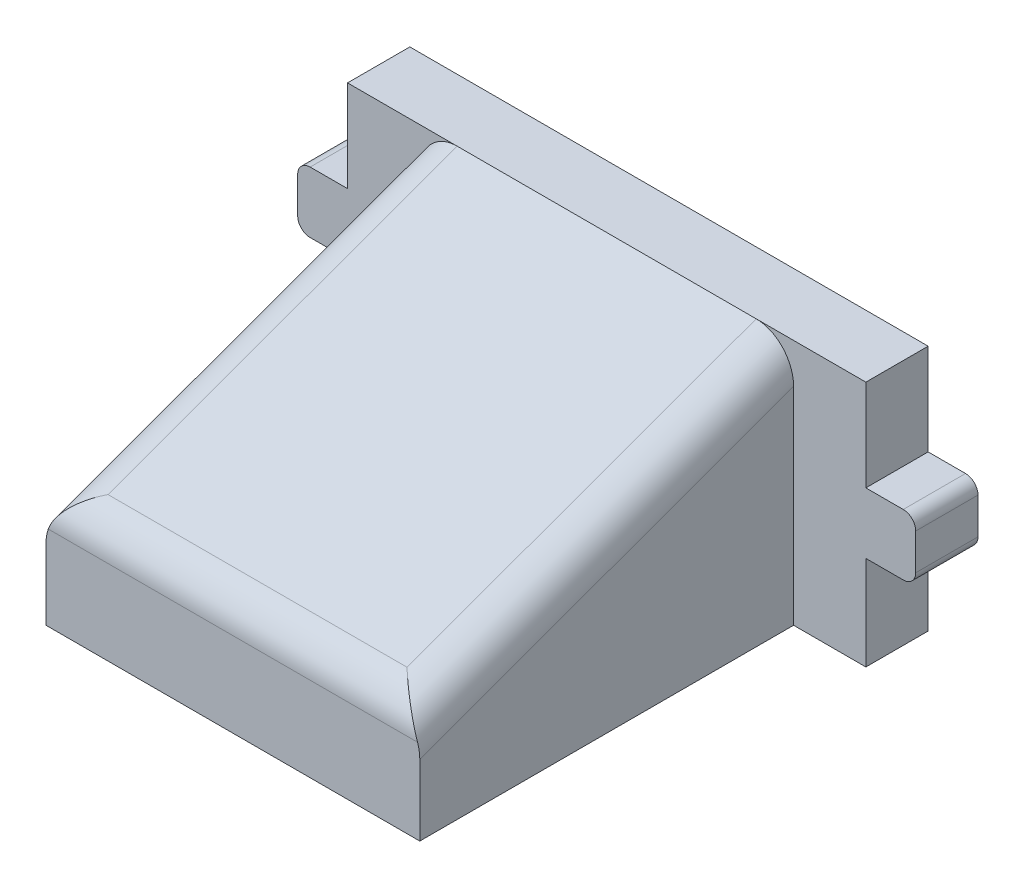
ISO-10303-21;
HEADER;
FILE_DESCRIPTION(('STEP AP214'),'2;1');
FILE_NAME('part.step','',(''),(''),'','','');
FILE_SCHEMA(('AUTOMOTIVE_DESIGN { 1 0 10303 214 1 1 1 1 }'));
ENDSEC;
DATA;
#1=APPLICATION_CONTEXT('core data for automotive mechanical design processes');
#2=APPLICATION_PROTOCOL_DEFINITION('international standard','automotive_design',2000,#1);
#3=PRODUCT_CONTEXT('',#1,'mechanical');
#4=PRODUCT('Part','Part','',(#3));
#5=PRODUCT_RELATED_PRODUCT_CATEGORY('part','',(#4));
#6=PRODUCT_DEFINITION_FORMATION('','',#4);
#7=PRODUCT_DEFINITION_CONTEXT('part definition',#1,'design');
#8=PRODUCT_DEFINITION('design','',#6,#7);
#9=PRODUCT_DEFINITION_SHAPE('','',#8);
#10=(LENGTH_UNIT() NAMED_UNIT(*) SI_UNIT(.MILLI.,.METRE.));
#11=(NAMED_UNIT(*) PLANE_ANGLE_UNIT() SI_UNIT($,.RADIAN.));
#12=(NAMED_UNIT(*) SI_UNIT($,.STERADIAN.) SOLID_ANGLE_UNIT());
#13=UNCERTAINTY_MEASURE_WITH_UNIT(LENGTH_MEASURE(1.E-05),#10,'distance_accuracy_value','');
#14=(GEOMETRIC_REPRESENTATION_CONTEXT(3) GLOBAL_UNCERTAINTY_ASSIGNED_CONTEXT((#13)) GLOBAL_UNIT_ASSIGNED_CONTEXT((#10,
#11,#12)) REPRESENTATION_CONTEXT('',''));
#15=CARTESIAN_POINT('',(0.,0.,0.));
#16=DIRECTION('',(0.,0.,1.));
#17=DIRECTION('',(1.,0.,0.));
#18=AXIS2_PLACEMENT_3D('',#15,#16,#17);
#19=CARTESIAN_POINT('',(0.,9.9,5.));
#20=DIRECTION('',(0.,0.939692620785908,0.342020143325669));
#21=DIRECTION('',(0.,-0.342020143325669,0.939692620785908));
#22=AXIS2_PLACEMENT_3D('',#19,#20,#21);
#23=PLANE('',#22);
#24=DIRECTION('',(1.,0.,0.));
#25=VECTOR('',#24,1.);
#26=CARTESIAN_POINT('',(-20.8,9.9,5.));
#27=LINE('',#26,#25);
#28=CARTESIAN_POINT('',(-12.,9.9,5.));
#29=VERTEX_POINT('',#28);
#30=CARTESIAN_POINT('',(12.,9.9,5.));
#31=VERTEX_POINT('',#30);
#32=EDGE_CURVE('E397',#29,#31,#27,.T.);
#33=ORIENTED_EDGE('',*,*,#32,.F.);
#34=DIRECTION('',(0.,0.342020143325669,-0.939692620785908));
#35=VECTOR('',#34,1.);
#36=CARTESIAN_POINT('',(-12.,9.9,5.));
#37=LINE('',#36,#35);
#38=CARTESIAN_POINT('',(-12.,-0.300651780257497,33.026060429977));
#39=VERTEX_POINT('',#38);
#40=EDGE_CURVE('E411',#29,#39,#37,.F.);
#41=ORIENTED_EDGE('',*,*,#40,.T.);
#42=DIRECTION('',(-1.,0.,0.));
#43=VECTOR('',#42,1.);
#44=CARTESIAN_POINT('',(15.,-0.300651780257497,33.026060429977));
#45=LINE('',#44,#43);
#46=CARTESIAN_POINT('',(12.,-0.300651780257497,33.026060429977));
#47=VERTEX_POINT('',#46);
#48=EDGE_CURVE('E408',#39,#47,#45,.F.);
#49=ORIENTED_EDGE('',*,*,#48,.T.);
#50=DIRECTION('',(0.,0.342020143325669,-0.939692620785908));
#51=VECTOR('',#50,1.);
#52=CARTESIAN_POINT('',(12.,9.9,5.));
#53=LINE('',#52,#51);
#54=EDGE_CURVE('E404',#47,#31,#53,.T.);
#55=ORIENTED_EDGE('',*,*,#54,.T.);
#56=EDGE_LOOP('',(#33,#41,#49,#55));
#57=FACE_BOUND('',#56,.T.);
#58=ADVANCED_FACE('F44',(#57),#23,.T.);
#59=CARTESIAN_POINT('',(0.,0.,5.));
#60=DIRECTION('',(0.,0.,1.));
#61=DIRECTION('',(1.,0.,0.));
#62=AXIS2_PLACEMENT_3D('',#59,#60,#61);
#63=PLANE('',#62);
#64=DIRECTION('',(0.,1.,0.));
#65=VECTOR('',#64,1.);
#66=CARTESIAN_POINT('',(15.,9.9,5.));
#67=LINE('',#66,#65);
#68=CARTESIAN_POINT('',(15.,-9.9,5.));
#69=VERTEX_POINT('',#68);
#70=CARTESIAN_POINT('',(15.,6.70746668257226,5.));
#71=VERTEX_POINT('',#70);
#72=EDGE_CURVE('E235',#69,#71,#67,.T.);
#73=ORIENTED_EDGE('',*,*,#72,.F.);
#74=DIRECTION('',(1.,0.,0.));
#75=VECTOR('',#74,1.);
#76=CARTESIAN_POINT('',(-20.8,-9.9,5.));
#77=LINE('',#76,#75);
#78=CARTESIAN_POINT('',(20.8,-9.9,5.));
#79=VERTEX_POINT('',#78);
#80=EDGE_CURVE('E310',#69,#79,#77,.T.);
#81=ORIENTED_EDGE('',*,*,#80,.T.);
#82=DIRECTION('',(0.,1.,0.));
#83=VECTOR('',#82,1.);
#84=CARTESIAN_POINT('',(20.8,9.9,5.));
#85=LINE('',#84,#83);
#86=CARTESIAN_POINT('',(20.8,-2.35,5.));
#87=VERTEX_POINT('',#86);
#88=EDGE_CURVE('E296',#79,#87,#85,.T.);
#89=ORIENTED_EDGE('',*,*,#88,.T.);
#90=DIRECTION('',(-1.,0.,0.));
#91=VECTOR('',#90,1.);
#92=CARTESIAN_POINT('',(24.8,-2.35,5.));
#93=LINE('',#92,#91);
#94=CARTESIAN_POINT('',(23.8,-2.35,5.));
#95=VERTEX_POINT('',#94);
#96=EDGE_CURVE('E286',#95,#87,#93,.T.);
#97=ORIENTED_EDGE('',*,*,#96,.F.);
#98=CARTESIAN_POINT('',(23.8,-1.35,5.));
#99=DIRECTION('',(0.,0.,1.));
#100=DIRECTION('',(1.,0.,0.));
#101=AXIS2_PLACEMENT_3D('',#98,#99,#100);
#102=CIRCLE('',#101,1.);
#103=CARTESIAN_POINT('',(24.8,-1.35,5.));
#104=VERTEX_POINT('',#103);
#105=EDGE_CURVE('E365',#95,#104,#102,.T.);
#106=ORIENTED_EDGE('',*,*,#105,.T.);
#107=DIRECTION('',(0.,-1.,0.));
#108=VECTOR('',#107,1.);
#109=CARTESIAN_POINT('',(24.8,2.55,5.));
#110=LINE('',#109,#108);
#111=CARTESIAN_POINT('',(24.8,1.55,5.));
#112=VERTEX_POINT('',#111);
#113=EDGE_CURVE('E272',#112,#104,#110,.T.);
#114=ORIENTED_EDGE('',*,*,#113,.F.);
#115=CARTESIAN_POINT('',(23.8,1.55,5.));
#116=DIRECTION('',(0.,0.,1.));
#117=DIRECTION('',(1.,0.,0.));
#118=AXIS2_PLACEMENT_3D('',#115,#116,#117);
#119=CIRCLE('',#118,1.);
#120=CARTESIAN_POINT('',(23.8,2.55,5.));
#121=VERTEX_POINT('',#120);
#122=EDGE_CURVE('E362',#112,#121,#119,.T.);
#123=ORIENTED_EDGE('',*,*,#122,.T.);
#124=DIRECTION('',(-1.,0.,0.));
#125=VECTOR('',#124,1.);
#126=CARTESIAN_POINT('',(24.8,2.55,5.));
#127=LINE('',#126,#125);
#128=CARTESIAN_POINT('',(20.8,2.55,5.));
#129=VERTEX_POINT('',#128);
#130=EDGE_CURVE('E289',#121,#129,#127,.T.);
#131=ORIENTED_EDGE('',*,*,#130,.T.);
#132=CARTESIAN_POINT('',(20.8,9.9,5.));
#133=VERTEX_POINT('',#132);
#134=EDGE_CURVE('E301',#129,#133,#85,.T.);
#135=ORIENTED_EDGE('',*,*,#134,.T.);
#136=DIRECTION('',(-1.,0.,0.));
#137=VECTOR('',#136,1.);
#138=CARTESIAN_POINT('',(-20.8,9.9,5.));
#139=LINE('',#138,#137);
#140=EDGE_CURVE('E302',#133,#31,#139,.T.);
#141=ORIENTED_EDGE('',*,*,#140,.T.);
#142=CARTESIAN_POINT('',(12.,6.70746668257226,5.));
#143=DIRECTION('',(0.,0.,1.));
#144=DIRECTION('',(0.,-1.,0.));
#145=AXIS2_PLACEMENT_3D('',#142,#143,#144);
#146=ELLIPSE('',#145,3.19253331742774,3.);
#147=EDGE_CURVE('E11',#31,#71,#146,.F.);
#148=ORIENTED_EDGE('',*,*,#147,.T.);
#149=EDGE_LOOP('',(#73,#81,#89,#97,#106,#114,#123,#131,#135,#141,#148));
#150=FACE_BOUND('',#149,.T.);
#151=ADVANCED_FACE('F460',(#150),#63,.T.);
#152=CARTESIAN_POINT('',(-20.8,9.9,5.));
#153=DIRECTION('',(1.,0.,0.));
#154=DIRECTION('',(0.,1.,0.));
#155=AXIS2_PLACEMENT_3D('',#152,#153,#154);
#156=PLANE('',#155);
#157=DIRECTION('',(0.,-1.,0.));
#158=VECTOR('',#157,1.);
#159=CARTESIAN_POINT('',(-20.8,9.9,0.));
#160=LINE('',#159,#158);
#161=CARTESIAN_POINT('',(-20.8,9.9,0.));
#162=VERTEX_POINT('',#161);
#163=CARTESIAN_POINT('',(-20.8,2.55,0.));
#164=VERTEX_POINT('',#163);
#165=EDGE_CURVE('E323',#162,#164,#160,.T.);
#166=ORIENTED_EDGE('',*,*,#165,.T.);
#167=DIRECTION('',(0.,0.,1.));
#168=VECTOR('',#167,1.);
#169=CARTESIAN_POINT('',(-20.8,2.55,5.));
#170=LINE('',#169,#168);
#171=CARTESIAN_POINT('',(-20.8,2.55,5.));
#172=VERTEX_POINT('',#171);
#173=EDGE_CURVE('E245',#164,#172,#170,.T.);
#174=ORIENTED_EDGE('',*,*,#173,.T.);
#175=DIRECTION('',(0.,-1.,0.));
#176=VECTOR('',#175,1.);
#177=CARTESIAN_POINT('',(-20.8,9.9,5.));
#178=LINE('',#177,#176);
#179=CARTESIAN_POINT('',(-20.8,9.9,5.));
#180=VERTEX_POINT('',#179);
#181=EDGE_CURVE('E306',#180,#172,#178,.T.);
#182=ORIENTED_EDGE('',*,*,#181,.F.);
#183=DIRECTION('',(0.,0.,-1.));
#184=VECTOR('',#183,1.);
#185=CARTESIAN_POINT('',(-20.8,9.9,5.));
#186=LINE('',#185,#184);
#187=EDGE_CURVE('E337',#180,#162,#186,.T.);
#188=ORIENTED_EDGE('',*,*,#187,.T.);
#189=EDGE_LOOP('',(#166,#174,#182,#188));
#190=FACE_BOUND('',#189,.T.);
#191=ADVANCED_FACE('F464',(#190),#156,.F.);
#192=CARTESIAN_POINT('',(20.8,9.9,5.));
#193=DIRECTION('',(-1.,0.,0.));
#194=DIRECTION('',(0.,0.,1.));
#195=AXIS2_PLACEMENT_3D('',#192,#193,#194);
#196=PLANE('',#195);
#197=DIRECTION('',(0.,0.,-1.));
#198=VECTOR('',#197,1.);
#199=CARTESIAN_POINT('',(20.8,-2.35,5.));
#200=LINE('',#199,#198);
#201=CARTESIAN_POINT('',(20.8,-2.35,0.));
#202=VERTEX_POINT('',#201);
#203=EDGE_CURVE('E273',#87,#202,#200,.T.);
#204=ORIENTED_EDGE('',*,*,#203,.F.);
#205=ORIENTED_EDGE('',*,*,#88,.F.);
#206=DIRECTION('',(0.,0.,-1.));
#207=VECTOR('',#206,1.);
#208=CARTESIAN_POINT('',(20.8,-9.9,5.));
#209=LINE('',#208,#207);
#210=CARTESIAN_POINT('',(20.8,-9.9,0.));
#211=VERTEX_POINT('',#210);
#212=EDGE_CURVE('E314',#79,#211,#209,.T.);
#213=ORIENTED_EDGE('',*,*,#212,.T.);
#214=DIRECTION('',(0.,1.,0.));
#215=VECTOR('',#214,1.);
#216=CARTESIAN_POINT('',(20.8,9.9,0.));
#217=LINE('',#216,#215);
#218=EDGE_CURVE('E315',#211,#202,#217,.T.);
#219=ORIENTED_EDGE('',*,*,#218,.T.);
#220=EDGE_LOOP('',(#204,#205,#213,#219));
#221=FACE_BOUND('',#220,.T.);
#222=ADVANCED_FACE('F487',(#221),#196,.F.);
#223=DIRECTION('',(0.,0.,1.));
#224=VECTOR('',#223,1.);
#225=CARTESIAN_POINT('',(20.8,2.55,5.));
#226=LINE('',#225,#224);
#227=CARTESIAN_POINT('',(20.8,2.55,0.));
#228=VERTEX_POINT('',#227);
#229=EDGE_CURVE('E267',#228,#129,#226,.T.);
#230=ORIENTED_EDGE('',*,*,#229,.F.);
#231=CARTESIAN_POINT('',(20.8,9.9,0.));
#232=VERTEX_POINT('',#231);
#233=EDGE_CURVE('E295',#228,#232,#217,.T.);
#234=ORIENTED_EDGE('',*,*,#233,.T.);
#235=DIRECTION('',(0.,0.,-1.));
#236=VECTOR('',#235,1.);
#237=CARTESIAN_POINT('',(20.8,9.9,5.));
#238=LINE('',#237,#236);
#239=EDGE_CURVE('E341',#133,#232,#238,.T.);
#240=ORIENTED_EDGE('',*,*,#239,.F.);
#241=ORIENTED_EDGE('',*,*,#134,.F.);
#242=EDGE_LOOP('',(#230,#234,#240,#241));
#243=FACE_BOUND('',#242,.T.);
#244=ADVANCED_FACE('F490',(#243),#196,.F.);
#245=CARTESIAN_POINT('',(-20.8,9.9,5.));
#246=DIRECTION('',(0.,-1.,0.));
#247=DIRECTION('',(0.,0.,-1.));
#248=AXIS2_PLACEMENT_3D('',#245,#246,#247);
#249=PLANE('',#248);
#250=EDGE_CURVE('E300',#29,#180,#139,.T.);
#251=ORIENTED_EDGE('',*,*,#250,.F.);
#252=ORIENTED_EDGE('',*,*,#32,.T.);
#253=ORIENTED_EDGE('',*,*,#140,.F.);
#254=ORIENTED_EDGE('',*,*,#239,.T.);
#255=DIRECTION('',(-1.,0.,0.));
#256=VECTOR('',#255,1.);
#257=CARTESIAN_POINT('',(-20.8,9.9,0.));
#258=LINE('',#257,#256);
#259=EDGE_CURVE('E319',#232,#162,#258,.T.);
#260=ORIENTED_EDGE('',*,*,#259,.T.);
#261=ORIENTED_EDGE('',*,*,#187,.F.);
#262=EDGE_LOOP('',(#251,#252,#253,#254,#260,#261));
#263=FACE_BOUND('',#262,.T.);
#264=ADVANCED_FACE('F445',(#263),#249,.F.);
#265=CARTESIAN_POINT('',(-20.8,-2.35,5.));
#266=VERTEX_POINT('',#265);
#267=CARTESIAN_POINT('',(-20.8,-9.9,5.));
#268=VERTEX_POINT('',#267);
#269=EDGE_CURVE('E305',#266,#268,#178,.T.);
#270=ORIENTED_EDGE('',*,*,#269,.F.);
#271=DIRECTION('',(0.,0.,-1.));
#272=VECTOR('',#271,1.);
#273=CARTESIAN_POINT('',(-20.8,-2.35,5.));
#274=LINE('',#273,#272);
#275=CARTESIAN_POINT('',(-20.8,-2.35,0.));
#276=VERTEX_POINT('',#275);
#277=EDGE_CURVE('E222',#266,#276,#274,.T.);
#278=ORIENTED_EDGE('',*,*,#277,.T.);
#279=CARTESIAN_POINT('',(-20.8,-9.9,0.));
#280=VERTEX_POINT('',#279);
#281=EDGE_CURVE('E322',#276,#280,#160,.T.);
#282=ORIENTED_EDGE('',*,*,#281,.T.);
#283=DIRECTION('',(0.,0.,-1.));
#284=VECTOR('',#283,1.);
#285=CARTESIAN_POINT('',(-20.8,-9.9,5.));
#286=LINE('',#285,#284);
#287=EDGE_CURVE('E333',#268,#280,#286,.T.);
#288=ORIENTED_EDGE('',*,*,#287,.F.);
#289=EDGE_LOOP('',(#270,#278,#282,#288));
#290=FACE_BOUND('',#289,.T.);
#291=ADVANCED_FACE('F494',(#290),#156,.F.);
#292=CARTESIAN_POINT('',(-20.8,-9.9,5.));
#293=DIRECTION('',(0.,1.,0.));
#294=DIRECTION('',(0.,0.,1.));
#295=AXIS2_PLACEMENT_3D('',#292,#293,#294);
#296=PLANE('',#295);
#297=DIRECTION('',(1.,0.,0.));
#298=VECTOR('',#297,1.);
#299=CARTESIAN_POINT('',(-20.8,-9.9,0.));
#300=LINE('',#299,#298);
#301=EDGE_CURVE('E327',#280,#211,#300,.T.);
#302=ORIENTED_EDGE('',*,*,#301,.T.);
#303=ORIENTED_EDGE('',*,*,#212,.F.);
#304=ORIENTED_EDGE('',*,*,#80,.F.);
#305=DIRECTION('',(0.,0.,-1.));
#306=VECTOR('',#305,1.);
#307=CARTESIAN_POINT('',(15.,-9.9,35.));
#308=LINE('',#307,#306);
#309=CARTESIAN_POINT('',(15.,-9.9,35.));
#310=VERTEX_POINT('',#309);
#311=EDGE_CURVE('E223',#310,#69,#308,.T.);
#312=ORIENTED_EDGE('',*,*,#311,.F.);
#313=DIRECTION('',(1.,0.,0.));
#314=VECTOR('',#313,1.);
#315=CARTESIAN_POINT('',(-15.,-9.9,35.));
#316=LINE('',#315,#314);
#317=CARTESIAN_POINT('',(-15.,-9.9,35.));
#318=VERTEX_POINT('',#317);
#319=EDGE_CURVE('E203',#318,#310,#316,.T.);
#320=ORIENTED_EDGE('',*,*,#319,.F.);
#321=DIRECTION('',(0.,0.,-1.));
#322=VECTOR('',#321,1.);
#323=CARTESIAN_POINT('',(-15.,-9.9,35.));
#324=LINE('',#323,#322);
#325=CARTESIAN_POINT('',(-15.,-9.9,5.));
#326=VERTEX_POINT('',#325);
#327=EDGE_CURVE('E214',#318,#326,#324,.T.);
#328=ORIENTED_EDGE('',*,*,#327,.T.);
#329=EDGE_CURVE('E311',#268,#326,#77,.T.);
#330=ORIENTED_EDGE('',*,*,#329,.F.);
#331=ORIENTED_EDGE('',*,*,#287,.T.);
#332=EDGE_LOOP('',(#302,#303,#304,#312,#320,#328,#330,#331));
#333=FACE_BOUND('',#332,.T.);
#334=ADVANCED_FACE('F225',(#333),#296,.F.);
#335=DIRECTION('',(0.,-1.,0.));
#336=VECTOR('',#335,1.);
#337=CARTESIAN_POINT('',(-15.,9.9,5.));
#338=LINE('',#337,#336);
#339=CARTESIAN_POINT('',(-15.,6.70746668257226,5.));
#340=VERTEX_POINT('',#339);
#341=EDGE_CURVE('E217',#340,#326,#338,.T.);
#342=ORIENTED_EDGE('',*,*,#341,.F.);
#343=CARTESIAN_POINT('',(-12.,6.70746668257226,5.));
#344=DIRECTION('',(0.,0.,1.));
#345=DIRECTION('',(0.,-1.,0.));
#346=AXIS2_PLACEMENT_3D('',#343,#344,#345);
#347=ELLIPSE('',#346,3.19253331742774,3.);
#348=EDGE_CURVE('E54',#340,#29,#347,.F.);
#349=ORIENTED_EDGE('',*,*,#348,.T.);
#350=ORIENTED_EDGE('',*,*,#250,.T.);
#351=ORIENTED_EDGE('',*,*,#181,.T.);
#352=DIRECTION('',(1.,0.,0.));
#353=VECTOR('',#352,1.);
#354=CARTESIAN_POINT('',(-24.8,2.55,5.));
#355=LINE('',#354,#353);
#356=CARTESIAN_POINT('',(-23.8,2.55,5.));
#357=VERTEX_POINT('',#356);
#358=EDGE_CURVE('E258',#357,#172,#355,.T.);
#359=ORIENTED_EDGE('',*,*,#358,.F.);
#360=CARTESIAN_POINT('',(-23.8,1.55,5.));
#361=DIRECTION('',(0.,0.,1.));
#362=DIRECTION('',(1.,0.,0.));
#363=AXIS2_PLACEMENT_3D('',#360,#361,#362);
#364=CIRCLE('',#363,1.);
#365=CARTESIAN_POINT('',(-24.8,1.55,5.));
#366=VERTEX_POINT('',#365);
#367=EDGE_CURVE('E387',#357,#366,#364,.T.);
#368=ORIENTED_EDGE('',*,*,#367,.T.);
#369=DIRECTION('',(0.,-1.,0.));
#370=VECTOR('',#369,1.);
#371=CARTESIAN_POINT('',(-24.8,2.55,5.));
#372=LINE('',#371,#370);
#373=CARTESIAN_POINT('',(-24.8,-1.35,5.));
#374=VERTEX_POINT('',#373);
#375=EDGE_CURVE('E244',#366,#374,#372,.T.);
#376=ORIENTED_EDGE('',*,*,#375,.T.);
#377=CARTESIAN_POINT('',(-23.8,-1.35,5.));
#378=DIRECTION('',(0.,0.,1.));
#379=DIRECTION('',(1.,0.,0.));
#380=AXIS2_PLACEMENT_3D('',#377,#378,#379);
#381=CIRCLE('',#380,1.);
#382=CARTESIAN_POINT('',(-23.8,-2.35,5.));
#383=VERTEX_POINT('',#382);
#384=EDGE_CURVE('E390',#374,#383,#381,.T.);
#385=ORIENTED_EDGE('',*,*,#384,.T.);
#386=DIRECTION('',(1.,0.,0.));
#387=VECTOR('',#386,1.);
#388=CARTESIAN_POINT('',(-24.8,-2.35,5.));
#389=LINE('',#388,#387);
#390=EDGE_CURVE('E261',#383,#266,#389,.T.);
#391=ORIENTED_EDGE('',*,*,#390,.T.);
#392=ORIENTED_EDGE('',*,*,#269,.T.);
#393=ORIENTED_EDGE('',*,*,#329,.T.);
#394=EDGE_LOOP('',(#342,#349,#350,#351,#359,#368,#376,#385,#391,#392,#393));
#395=FACE_BOUND('',#394,.T.);
#396=ADVANCED_FACE('F451',(#395),#63,.T.);
#397=CARTESIAN_POINT('',(0.,0.,0.));
#398=DIRECTION('',(0.,0.,1.));
#399=DIRECTION('',(1.,0.,0.));
#400=AXIS2_PLACEMENT_3D('',#397,#398,#399);
#401=PLANE('',#400);
#402=DIRECTION('',(1.,0.,0.));
#403=VECTOR('',#402,1.);
#404=CARTESIAN_POINT('',(-24.8,-2.35,0.));
#405=LINE('',#404,#403);
#406=CARTESIAN_POINT('',(-23.8,-2.35,0.));
#407=VERTEX_POINT('',#406);
#408=EDGE_CURVE('E264',#407,#276,#405,.T.);
#409=ORIENTED_EDGE('',*,*,#408,.F.);
#410=CARTESIAN_POINT('',(-23.8,-1.35,0.));
#411=DIRECTION('',(0.,0.,1.));
#412=DIRECTION('',(1.,0.,0.));
#413=AXIS2_PLACEMENT_3D('',#410,#411,#412);
#414=CIRCLE('',#413,1.);
#415=CARTESIAN_POINT('',(-24.8,-1.35,0.));
#416=VERTEX_POINT('',#415);
#417=EDGE_CURVE('E378',#407,#416,#414,.F.);
#418=ORIENTED_EDGE('',*,*,#417,.T.);
#419=DIRECTION('',(0.,1.,0.));
#420=VECTOR('',#419,1.);
#421=CARTESIAN_POINT('',(-24.8,2.55,0.));
#422=LINE('',#421,#420);
#423=CARTESIAN_POINT('',(-24.8,1.55,0.));
#424=VERTEX_POINT('',#423);
#425=EDGE_CURVE('E240',#416,#424,#422,.T.);
#426=ORIENTED_EDGE('',*,*,#425,.T.);
#427=CARTESIAN_POINT('',(-23.8,1.55,0.));
#428=DIRECTION('',(0.,0.,1.));
#429=DIRECTION('',(1.,0.,0.));
#430=AXIS2_PLACEMENT_3D('',#427,#428,#429);
#431=CIRCLE('',#430,1.);
#432=CARTESIAN_POINT('',(-23.8,2.55,0.));
#433=VERTEX_POINT('',#432);
#434=EDGE_CURVE('E375',#424,#433,#431,.F.);
#435=ORIENTED_EDGE('',*,*,#434,.T.);
#436=DIRECTION('',(1.,0.,0.));
#437=VECTOR('',#436,1.);
#438=CARTESIAN_POINT('',(-24.8,2.55,0.));
#439=LINE('',#438,#437);
#440=EDGE_CURVE('E249',#433,#164,#439,.T.);
#441=ORIENTED_EDGE('',*,*,#440,.T.);
#442=ORIENTED_EDGE('',*,*,#165,.F.);
#443=ORIENTED_EDGE('',*,*,#259,.F.);
#444=ORIENTED_EDGE('',*,*,#233,.F.);
#445=DIRECTION('',(-1.,0.,0.));
#446=VECTOR('',#445,1.);
#447=CARTESIAN_POINT('',(24.8,2.55,0.));
#448=LINE('',#447,#446);
#449=CARTESIAN_POINT('',(23.8,2.55,0.));
#450=VERTEX_POINT('',#449);
#451=EDGE_CURVE('E292',#450,#228,#448,.T.);
#452=ORIENTED_EDGE('',*,*,#451,.F.);
#453=CARTESIAN_POINT('',(23.8,1.55,0.));
#454=DIRECTION('',(0.,0.,1.));
#455=DIRECTION('',(1.,0.,0.));
#456=AXIS2_PLACEMENT_3D('',#453,#454,#455);
#457=CIRCLE('',#456,1.);
#458=CARTESIAN_POINT('',(24.8,1.55,0.));
#459=VERTEX_POINT('',#458);
#460=EDGE_CURVE('E353',#450,#459,#457,.F.);
#461=ORIENTED_EDGE('',*,*,#460,.T.);
#462=DIRECTION('',(0.,1.,0.));
#463=VECTOR('',#462,1.);
#464=CARTESIAN_POINT('',(24.8,2.55,0.));
#465=LINE('',#464,#463);
#466=CARTESIAN_POINT('',(24.8,-1.35,0.));
#467=VERTEX_POINT('',#466);
#468=EDGE_CURVE('E268',#467,#459,#465,.T.);
#469=ORIENTED_EDGE('',*,*,#468,.F.);
#470=CARTESIAN_POINT('',(23.8,-1.35,0.));
#471=DIRECTION('',(0.,0.,1.));
#472=DIRECTION('',(1.,0.,0.));
#473=AXIS2_PLACEMENT_3D('',#470,#471,#472);
#474=CIRCLE('',#473,1.);
#475=CARTESIAN_POINT('',(23.8,-2.35,0.));
#476=VERTEX_POINT('',#475);
#477=EDGE_CURVE('E356',#467,#476,#474,.F.);
#478=ORIENTED_EDGE('',*,*,#477,.T.);
#479=DIRECTION('',(-1.,0.,0.));
#480=VECTOR('',#479,1.);
#481=CARTESIAN_POINT('',(24.8,-2.35,0.));
#482=LINE('',#481,#480);
#483=EDGE_CURVE('E277',#476,#202,#482,.T.);
#484=ORIENTED_EDGE('',*,*,#483,.T.);
#485=ORIENTED_EDGE('',*,*,#218,.F.);
#486=ORIENTED_EDGE('',*,*,#301,.F.);
#487=ORIENTED_EDGE('',*,*,#281,.F.);
#488=EDGE_LOOP('',(#409,#418,#426,#435,#441,#442,#443,#444,#452,#461,#469,#478,#484,#485,#486,#487));
#489=FACE_BOUND('',#488,.T.);
#490=ADVANCED_FACE('F500',(#489),#401,.F.);
#491=CARTESIAN_POINT('',(24.8,2.55,5.));
#492=DIRECTION('',(0.,-1.,0.));
#493=DIRECTION('',(0.,0.,-1.));
#494=AXIS2_PLACEMENT_3D('',#491,#492,#493);
#495=PLANE('',#494);
#496=ORIENTED_EDGE('',*,*,#130,.F.);
#497=DIRECTION('',(0.,0.,1.));
#498=VECTOR('',#497,1.);
#499=CARTESIAN_POINT('',(23.8,2.55,0.));
#500=LINE('',#499,#498);
#501=EDGE_CURVE('E368',#121,#450,#500,.F.);
#502=ORIENTED_EDGE('',*,*,#501,.T.);
#503=ORIENTED_EDGE('',*,*,#451,.T.);
#504=ORIENTED_EDGE('',*,*,#229,.T.);
#505=EDGE_LOOP('',(#496,#502,#503,#504));
#506=FACE_BOUND('',#505,.T.);
#507=ADVANCED_FACE('F502',(#506),#495,.F.);
#508=CARTESIAN_POINT('',(24.8,-2.35,5.));
#509=DIRECTION('',(0.,1.,0.));
#510=DIRECTION('',(0.,0.,1.));
#511=AXIS2_PLACEMENT_3D('',#508,#509,#510);
#512=PLANE('',#511);
#513=ORIENTED_EDGE('',*,*,#483,.F.);
#514=DIRECTION('',(0.,0.,-1.));
#515=VECTOR('',#514,1.);
#516=CARTESIAN_POINT('',(23.8,-2.35,5.));
#517=LINE('',#516,#515);
#518=EDGE_CURVE('E359',#476,#95,#517,.F.);
#519=ORIENTED_EDGE('',*,*,#518,.T.);
#520=ORIENTED_EDGE('',*,*,#96,.T.);
#521=ORIENTED_EDGE('',*,*,#203,.T.);
#522=EDGE_LOOP('',(#513,#519,#520,#521));
#523=FACE_BOUND('',#522,.T.);
#524=ADVANCED_FACE('F508',(#523),#512,.F.);
#525=CARTESIAN_POINT('',(24.8,0.,0.));
#526=DIRECTION('',(1.,0.,0.));
#527=DIRECTION('',(0.,0.,-1.));
#528=AXIS2_PLACEMENT_3D('',#525,#526,#527);
#529=PLANE('',#528);
#530=ORIENTED_EDGE('',*,*,#113,.T.);
#531=DIRECTION('',(0.,0.,-1.));
#532=VECTOR('',#531,1.);
#533=CARTESIAN_POINT('',(24.8,-1.35,0.));
#534=LINE('',#533,#532);
#535=EDGE_CURVE('E349',#104,#467,#534,.T.);
#536=ORIENTED_EDGE('',*,*,#535,.T.);
#537=ORIENTED_EDGE('',*,*,#468,.T.);
#538=DIRECTION('',(0.,0.,1.));
#539=VECTOR('',#538,1.);
#540=CARTESIAN_POINT('',(24.8,1.55,5.));
#541=LINE('',#540,#539);
#542=EDGE_CURVE('E345',#459,#112,#541,.T.);
#543=ORIENTED_EDGE('',*,*,#542,.T.);
#544=EDGE_LOOP('',(#530,#536,#537,#543));
#545=FACE_BOUND('',#544,.T.);
#546=ADVANCED_FACE('F485',(#545),#529,.T.);
#547=CARTESIAN_POINT('',(23.8,-1.35,0.));
#548=DIRECTION('',(0.,0.,1.));
#549=DIRECTION('',(1.,0.,0.));
#550=AXIS2_PLACEMENT_3D('',#547,#548,#549);
#551=CYLINDRICAL_SURFACE('',#550,1.);
#552=ORIENTED_EDGE('',*,*,#105,.F.);
#553=ORIENTED_EDGE('',*,*,#518,.F.);
#554=ORIENTED_EDGE('',*,*,#477,.F.);
#555=ORIENTED_EDGE('',*,*,#535,.F.);
#556=EDGE_LOOP('',(#552,#553,#554,#555));
#557=FACE_BOUND('',#556,.T.);
#558=ADVANCED_FACE('F481',(#557),#551,.T.);
#559=CARTESIAN_POINT('',(23.8,1.55,0.));
#560=DIRECTION('',(0.,0.,-1.));
#561=DIRECTION('',(-1.,0.,0.));
#562=AXIS2_PLACEMENT_3D('',#559,#560,#561);
#563=CYLINDRICAL_SURFACE('',#562,1.);
#564=ORIENTED_EDGE('',*,*,#460,.F.);
#565=ORIENTED_EDGE('',*,*,#501,.F.);
#566=ORIENTED_EDGE('',*,*,#122,.F.);
#567=ORIENTED_EDGE('',*,*,#542,.F.);
#568=EDGE_LOOP('',(#564,#565,#566,#567));
#569=FACE_BOUND('',#568,.T.);
#570=ADVANCED_FACE('F477',(#569),#563,.T.);
#571=CARTESIAN_POINT('',(-24.8,-2.35,5.));
#572=DIRECTION('',(0.,-1.,0.));
#573=DIRECTION('',(0.,0.,-1.));
#574=AXIS2_PLACEMENT_3D('',#571,#572,#573);
#575=PLANE('',#574);
#576=ORIENTED_EDGE('',*,*,#390,.F.);
#577=DIRECTION('',(0.,0.,-1.));
#578=VECTOR('',#577,1.);
#579=CARTESIAN_POINT('',(-23.8,-2.35,5.));
#580=LINE('',#579,#578);
#581=EDGE_CURVE('E371',#383,#407,#580,.T.);
#582=ORIENTED_EDGE('',*,*,#581,.T.);
#583=ORIENTED_EDGE('',*,*,#408,.T.);
#584=ORIENTED_EDGE('',*,*,#277,.F.);
#585=EDGE_LOOP('',(#576,#582,#583,#584));
#586=FACE_BOUND('',#585,.T.);
#587=ADVANCED_FACE('F480',(#586),#575,.T.);
#588=CARTESIAN_POINT('',(-24.8,2.55,5.));
#589=DIRECTION('',(0.,1.,0.));
#590=DIRECTION('',(0.,0.,1.));
#591=AXIS2_PLACEMENT_3D('',#588,#589,#590);
#592=PLANE('',#591);
#593=ORIENTED_EDGE('',*,*,#440,.F.);
#594=DIRECTION('',(0.,0.,1.));
#595=VECTOR('',#594,1.);
#596=CARTESIAN_POINT('',(-23.8,2.55,5.));
#597=LINE('',#596,#595);
#598=EDGE_CURVE('E393',#433,#357,#597,.T.);
#599=ORIENTED_EDGE('',*,*,#598,.T.);
#600=ORIENTED_EDGE('',*,*,#358,.T.);
#601=ORIENTED_EDGE('',*,*,#173,.F.);
#602=EDGE_LOOP('',(#593,#599,#600,#601));
#603=FACE_BOUND('',#602,.T.);
#604=ADVANCED_FACE('F518',(#603),#592,.T.);
#605=CARTESIAN_POINT('',(-24.8,0.,0.));
#606=DIRECTION('',(-1.,0.,0.));
#607=DIRECTION('',(0.,0.,-1.));
#608=AXIS2_PLACEMENT_3D('',#605,#606,#607);
#609=PLANE('',#608);
#610=ORIENTED_EDGE('',*,*,#425,.F.);
#611=DIRECTION('',(0.,0.,-1.));
#612=VECTOR('',#611,1.);
#613=CARTESIAN_POINT('',(-24.8,-1.35,0.));
#614=LINE('',#613,#612);
#615=EDGE_CURVE('E384',#416,#374,#614,.F.);
#616=ORIENTED_EDGE('',*,*,#615,.T.);
#617=ORIENTED_EDGE('',*,*,#375,.F.);
#618=DIRECTION('',(0.,0.,1.));
#619=VECTOR('',#618,1.);
#620=CARTESIAN_POINT('',(-24.8,1.55,0.));
#621=LINE('',#620,#619);
#622=EDGE_CURVE('E381',#366,#424,#621,.F.);
#623=ORIENTED_EDGE('',*,*,#622,.T.);
#624=EDGE_LOOP('',(#610,#616,#617,#623));
#625=FACE_BOUND('',#624,.T.);
#626=ADVANCED_FACE('F475',(#625),#609,.T.);
#627=CARTESIAN_POINT('',(-23.8,-1.35,5.));
#628=DIRECTION('',(0.,0.,-1.));
#629=DIRECTION('',(-1.,0.,0.));
#630=AXIS2_PLACEMENT_3D('',#627,#628,#629);
#631=CYLINDRICAL_SURFACE('',#630,1.);
#632=ORIENTED_EDGE('',*,*,#384,.F.);
#633=ORIENTED_EDGE('',*,*,#615,.F.);
#634=ORIENTED_EDGE('',*,*,#417,.F.);
#635=ORIENTED_EDGE('',*,*,#581,.F.);
#636=EDGE_LOOP('',(#632,#633,#634,#635));
#637=FACE_BOUND('',#636,.T.);
#638=ADVANCED_FACE('F471',(#637),#631,.T.);
#639=CARTESIAN_POINT('',(-23.8,1.55,5.));
#640=DIRECTION('',(0.,0.,1.));
#641=DIRECTION('',(1.,0.,0.));
#642=AXIS2_PLACEMENT_3D('',#639,#640,#641);
#643=CYLINDRICAL_SURFACE('',#642,1.);
#644=ORIENTED_EDGE('',*,*,#434,.F.);
#645=ORIENTED_EDGE('',*,*,#622,.F.);
#646=ORIENTED_EDGE('',*,*,#367,.F.);
#647=ORIENTED_EDGE('',*,*,#598,.F.);
#648=EDGE_LOOP('',(#644,#645,#646,#647));
#649=FACE_BOUND('',#648,.T.);
#650=ADVANCED_FACE('F467',(#649),#643,.T.);
#651=CARTESIAN_POINT('',(15.,9.9,35.));
#652=DIRECTION('',(-1.,0.,0.));
#653=DIRECTION('',(0.,0.,1.));
#654=AXIS2_PLACEMENT_3D('',#651,#652,#653);
#655=PLANE('',#654);
#656=ORIENTED_EDGE('',*,*,#72,.T.);
#657=DIRECTION('',(0.,-0.342020143325669,0.939692620785908));
#658=VECTOR('',#657,1.);
#659=CARTESIAN_POINT('',(15.,-2.56089200765583,30.4646062168076));
#660=LINE('',#659,#658);
#661=CARTESIAN_POINT('',(15.,-4.21164034541383,35.));
#662=VERTEX_POINT('',#661);
#663=EDGE_CURVE('E421',#71,#662,#660,.T.);
#664=ORIENTED_EDGE('',*,*,#663,.T.);
#665=DIRECTION('',(0.,1.,0.));
#666=VECTOR('',#665,1.);
#667=CARTESIAN_POINT('',(15.,9.9,35.));
#668=LINE('',#667,#666);
#669=EDGE_CURVE('E211',#310,#662,#668,.T.);
#670=ORIENTED_EDGE('',*,*,#669,.F.);
#671=ORIENTED_EDGE('',*,*,#311,.T.);
#672=EDGE_LOOP('',(#656,#664,#670,#671));
#673=FACE_BOUND('',#672,.T.);
#674=ADVANCED_FACE('F470',(#673),#655,.F.);
#675=CARTESIAN_POINT('',(-15.,9.9,35.));
#676=DIRECTION('',(1.,0.,0.));
#677=DIRECTION('',(0.,0.,-1.));
#678=AXIS2_PLACEMENT_3D('',#675,#676,#677);
#679=PLANE('',#678);
#680=DIRECTION('',(0.,-1.,0.));
#681=VECTOR('',#680,1.);
#682=CARTESIAN_POINT('',(-15.,9.9,35.));
#683=LINE('',#682,#681);
#684=CARTESIAN_POINT('',(-15.,-4.21164034541382,35.));
#685=VERTEX_POINT('',#684);
#686=EDGE_CURVE('E198',#685,#318,#683,.T.);
#687=ORIENTED_EDGE('',*,*,#686,.F.);
#688=DIRECTION('',(0.,-0.342020143325669,0.939692620785908));
#689=VECTOR('',#688,1.);
#690=CARTESIAN_POINT('',(-15.,-2.56089200765583,30.4646062168076));
#691=LINE('',#690,#689);
#692=EDGE_CURVE('E401',#685,#340,#691,.F.);
#693=ORIENTED_EDGE('',*,*,#692,.T.);
#694=ORIENTED_EDGE('',*,*,#341,.T.);
#695=ORIENTED_EDGE('',*,*,#327,.F.);
#696=EDGE_LOOP('',(#687,#693,#694,#695));
#697=FACE_BOUND('',#696,.T.);
#698=ADVANCED_FACE('F215',(#697),#679,.F.);
#699=CARTESIAN_POINT('',(0.,0.,35.));
#700=DIRECTION('',(0.,0.,1.));
#701=DIRECTION('',(1.,0.,0.));
#702=AXIS2_PLACEMENT_3D('',#699,#700,#701);
#703=PLANE('',#702);
#704=DIRECTION('',(1.,0.,0.));
#705=VECTOR('',#704,1.);
#706=CARTESIAN_POINT('',(-15.,-3.11972964261522,35.));
#707=LINE('',#706,#705);
#708=CARTESIAN_POINT('',(14.8190778623577,-3.11972964261522,35.));
#709=VERTEX_POINT('',#708);
#710=CARTESIAN_POINT('',(-14.8190778623577,-3.11972964261522,35.));
#711=VERTEX_POINT('',#710);
#712=EDGE_CURVE('E68',#709,#711,#707,.F.);
#713=ORIENTED_EDGE('',*,*,#712,.T.);
#714=CARTESIAN_POINT('',(-12.,-4.21164034541383,35.));
#715=DIRECTION('',(0.,0.,1.));
#716=DIRECTION('',(0.,-1.,0.));
#717=AXIS2_PLACEMENT_3D('',#714,#715,#716);
#718=ELLIPSE('',#717,3.19253331742774,3.);
#719=EDGE_CURVE('E206',#711,#685,#718,.T.);
#720=ORIENTED_EDGE('',*,*,#719,.T.);
#721=ORIENTED_EDGE('',*,*,#686,.T.);
#722=ORIENTED_EDGE('',*,*,#319,.T.);
#723=ORIENTED_EDGE('',*,*,#669,.T.);
#724=CARTESIAN_POINT('',(12.,-4.21164034541383,35.));
#725=DIRECTION('',(0.,0.,1.));
#726=DIRECTION('',(0.,-1.,0.));
#727=AXIS2_PLACEMENT_3D('',#724,#725,#726);
#728=ELLIPSE('',#727,3.19253331742774,3.);
#729=EDGE_CURVE('E414',#662,#709,#728,.T.);
#730=ORIENTED_EDGE('',*,*,#729,.T.);
#731=EDGE_LOOP('',(#713,#720,#721,#722,#723,#730));
#732=FACE_BOUND('',#731,.T.);
#733=ADVANCED_FACE('F200',(#732),#703,.T.);
#734=CARTESIAN_POINT('',(12.,7.08092213764228,3.97393957002299));
#735=DIRECTION('',(0.,-0.342020143325669,0.939692620785908));
#736=DIRECTION('',(0.,-0.939692620785908,-0.342020143325669));
#737=AXIS2_PLACEMENT_3D('',#734,#735,#736);
#738=CYLINDRICAL_SURFACE('',#737,3.);
#739=ORIENTED_EDGE('',*,*,#147,.F.);
#740=ORIENTED_EDGE('',*,*,#54,.F.);
#741=CARTESIAN_POINT('',(12.,-3.11972964261522,32.));
#742=DIRECTION('',(-0.707106781186547,-0.241844762647976,0.664463024388675));
#743=DIRECTION('',(0.707106781186547,-0.241844762647976,0.664463024388675));
#744=AXIS2_PLACEMENT_3D('',#741,#742,#743);
#745=ELLIPSE('',#744,4.24264068711928,3.);
#746=EDGE_CURVE('E48',#709,#47,#745,.T.);
#747=ORIENTED_EDGE('',*,*,#746,.F.);
#748=ORIENTED_EDGE('',*,*,#729,.F.);
#749=ORIENTED_EDGE('',*,*,#663,.F.);
#750=EDGE_LOOP('',(#739,#740,#747,#748,#749));
#751=FACE_BOUND('',#750,.T.);
#752=ADVANCED_FACE('F46',(#751),#738,.T.);
#753=CARTESIAN_POINT('',(0.,-3.11972964261522,32.));
#754=DIRECTION('',(-1.,0.,0.));
#755=DIRECTION('',(0.,0.,1.));
#756=AXIS2_PLACEMENT_3D('',#753,#754,#755);
#757=CYLINDRICAL_SURFACE('',#756,3.);
#758=ORIENTED_EDGE('',*,*,#746,.T.);
#759=ORIENTED_EDGE('',*,*,#48,.F.);
#760=CARTESIAN_POINT('',(-12.,-3.11972964261522,32.));
#761=DIRECTION('',(-0.707106781186547,0.241844762647976,-0.664463024388675));
#762=DIRECTION('',(-0.707106781186547,-0.241844762647976,0.664463024388675));
#763=AXIS2_PLACEMENT_3D('',#760,#761,#762);
#764=ELLIPSE('',#763,4.24264068711928,3.);
#765=EDGE_CURVE('E426',#711,#39,#764,.T.);
#766=ORIENTED_EDGE('',*,*,#765,.F.);
#767=ORIENTED_EDGE('',*,*,#712,.F.);
#768=EDGE_LOOP('',(#758,#759,#766,#767));
#769=FACE_BOUND('',#768,.T.);
#770=ADVANCED_FACE('F436',(#769),#757,.T.);
#771=CARTESIAN_POINT('',(-12.,-2.56089200765583,30.4646062168076));
#772=DIRECTION('',(0.,-0.342020143325669,0.939692620785908));
#773=DIRECTION('',(0.,-0.939692620785908,-0.342020143325669));
#774=AXIS2_PLACEMENT_3D('',#771,#772,#773);
#775=CYLINDRICAL_SURFACE('',#774,3.);
#776=ORIENTED_EDGE('',*,*,#765,.T.);
#777=ORIENTED_EDGE('',*,*,#40,.F.);
#778=ORIENTED_EDGE('',*,*,#348,.F.);
#779=ORIENTED_EDGE('',*,*,#692,.F.);
#780=ORIENTED_EDGE('',*,*,#719,.F.);
#781=EDGE_LOOP('',(#776,#777,#778,#779,#780));
#782=FACE_BOUND('',#781,.T.);
#783=ADVANCED_FACE('F452',(#782),#775,.T.);
#784=CLOSED_SHELL('',(#58,#151,#191,#222,#244,#264,#291,#334,#396,#490,#507,#524,#546,#558,#570,
#587,#604,#626,#638,#650,#674,#698,#733,#752,#770,#783));
#785=MANIFOLD_SOLID_BREP('B2',#784);
#786=ADVANCED_BREP_SHAPE_REPRESENTATION('',(#18,#785),#14);
#787=SHAPE_DEFINITION_REPRESENTATION(#9,#786);
ENDSEC;
END-ISO-10303-21;
